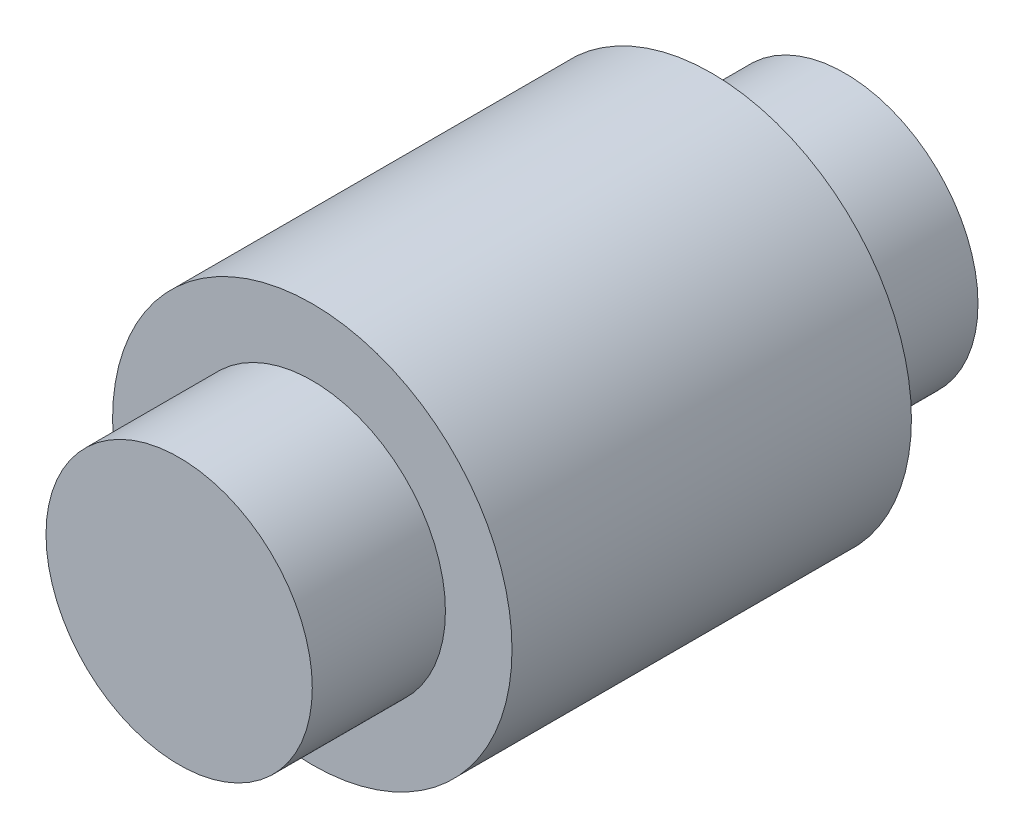
ISO-10303-21;
HEADER;
FILE_DESCRIPTION(('STEP AP214'),'2;1');
FILE_NAME('part.step','',(''),(''),'','','');
FILE_SCHEMA(('AUTOMOTIVE_DESIGN { 1 0 10303 214 1 1 1 1 }'));
ENDSEC;
DATA;
#1=APPLICATION_CONTEXT('core data for automotive mechanical design processes');
#2=APPLICATION_PROTOCOL_DEFINITION('international standard','automotive_design',2000,#1);
#3=PRODUCT_CONTEXT('',#1,'mechanical');
#4=PRODUCT('Part','Part','',(#3));
#5=PRODUCT_RELATED_PRODUCT_CATEGORY('part','',(#4));
#6=PRODUCT_DEFINITION_FORMATION('','',#4);
#7=PRODUCT_DEFINITION_CONTEXT('part definition',#1,'design');
#8=PRODUCT_DEFINITION('design','',#6,#7);
#9=PRODUCT_DEFINITION_SHAPE('','',#8);
#10=(LENGTH_UNIT() NAMED_UNIT(*) SI_UNIT(.MILLI.,.METRE.));
#11=(NAMED_UNIT(*) PLANE_ANGLE_UNIT() SI_UNIT($,.RADIAN.));
#12=(NAMED_UNIT(*) SI_UNIT($,.STERADIAN.) SOLID_ANGLE_UNIT());
#13=UNCERTAINTY_MEASURE_WITH_UNIT(LENGTH_MEASURE(1.E-05),#10,'distance_accuracy_value','');
#14=(GEOMETRIC_REPRESENTATION_CONTEXT(3) GLOBAL_UNCERTAINTY_ASSIGNED_CONTEXT((#13)) GLOBAL_UNIT_ASSIGNED_CONTEXT((#10,
#11,#12)) REPRESENTATION_CONTEXT('',''));
#15=CARTESIAN_POINT('',(0.,0.,0.));
#16=DIRECTION('',(0.,0.,1.));
#17=DIRECTION('',(1.,0.,0.));
#18=AXIS2_PLACEMENT_3D('',#15,#16,#17);
#19=CARTESIAN_POINT('',(0.,0.,5.));
#20=DIRECTION('',(0.,0.,-1.));
#21=DIRECTION('',(-1.,0.,0.));
#22=AXIS2_PLACEMENT_3D('',#19,#20,#21);
#23=CYLINDRICAL_SURFACE('',#22,5.);
#24=CARTESIAN_POINT('',(0.,0.,5.));
#25=DIRECTION('',(0.,0.,1.));
#26=DIRECTION('',(1.,0.,0.));
#27=AXIS2_PLACEMENT_3D('',#24,#25,#26);
#28=CIRCLE('',#27,5.);
#29=CARTESIAN_POINT('',(5.,0.,5.));
#30=VERTEX_POINT('',#29);
#31=EDGE_CURVE('E49',#30,#30,#28,.T.);
#32=ORIENTED_EDGE('',*,*,#31,.F.);
#33=EDGE_LOOP('',(#32));
#34=FACE_BOUND('',#33,.T.);
#35=CARTESIAN_POINT('',(0.,0.,0.));
#36=DIRECTION('',(0.,0.,1.));
#37=DIRECTION('',(1.,0.,0.));
#38=AXIS2_PLACEMENT_3D('',#35,#36,#37);
#39=CIRCLE('',#38,5.);
#40=CARTESIAN_POINT('',(5.,0.,0.));
#41=VERTEX_POINT('',#40);
#42=EDGE_CURVE('E44',#41,#41,#39,.T.);
#43=ORIENTED_EDGE('',*,*,#42,.T.);
#44=EDGE_LOOP('',(#43));
#45=FACE_BOUND('',#44,.T.);
#46=ADVANCED_FACE('F41',(#34,#45),#23,.T.);
#47=CARTESIAN_POINT('',(0.,0.,0.));
#48=DIRECTION('',(0.,0.,1.));
#49=DIRECTION('',(1.,0.,0.));
#50=AXIS2_PLACEMENT_3D('',#47,#48,#49);
#51=PLANE('',#50);
#52=ORIENTED_EDGE('',*,*,#42,.F.);
#53=EDGE_LOOP('',(#52));
#54=FACE_BOUND('',#53,.T.);
#55=ADVANCED_FACE('F87',(#54),#51,.F.);
#56=CARTESIAN_POINT('',(0.,0.,20.));
#57=DIRECTION('',(0.,0.,-1.));
#58=DIRECTION('',(-1.,0.,0.));
#59=AXIS2_PLACEMENT_3D('',#56,#57,#58);
#60=CYLINDRICAL_SURFACE('',#59,7.5);
#61=CARTESIAN_POINT('',(0.,0.,20.));
#62=DIRECTION('',(0.,0.,1.));
#63=DIRECTION('',(1.,0.,0.));
#64=AXIS2_PLACEMENT_3D('',#61,#62,#63);
#65=CIRCLE('',#64,7.5);
#66=CARTESIAN_POINT('',(7.5,0.,20.));
#67=VERTEX_POINT('',#66);
#68=EDGE_CURVE('E61',#67,#67,#65,.T.);
#69=ORIENTED_EDGE('',*,*,#68,.F.);
#70=EDGE_LOOP('',(#69));
#71=FACE_BOUND('',#70,.T.);
#72=CARTESIAN_POINT('',(0.,0.,5.));
#73=DIRECTION('',(0.,0.,1.));
#74=DIRECTION('',(1.,0.,0.));
#75=AXIS2_PLACEMENT_3D('',#72,#73,#74);
#76=CIRCLE('',#75,7.5);
#77=CARTESIAN_POINT('',(7.5,0.,5.));
#78=VERTEX_POINT('',#77);
#79=EDGE_CURVE('E60',#78,#78,#76,.T.);
#80=ORIENTED_EDGE('',*,*,#79,.T.);
#81=EDGE_LOOP('',(#80));
#82=FACE_BOUND('',#81,.T.);
#83=ADVANCED_FACE('F69',(#71,#82),#60,.T.);
#84=CARTESIAN_POINT('',(0.,0.,20.));
#85=DIRECTION('',(0.,0.,1.));
#86=DIRECTION('',(1.,0.,0.));
#87=AXIS2_PLACEMENT_3D('',#84,#85,#86);
#88=PLANE('',#87);
#89=CARTESIAN_POINT('',(0.,0.,20.));
#90=DIRECTION('',(0.,0.,1.));
#91=DIRECTION('',(1.,0.,0.));
#92=AXIS2_PLACEMENT_3D('',#89,#90,#91);
#93=CIRCLE('',#92,5.);
#94=CARTESIAN_POINT('',(5.,0.,20.));
#95=VERTEX_POINT('',#94);
#96=EDGE_CURVE('E10',#95,#95,#93,.T.);
#97=ORIENTED_EDGE('',*,*,#96,.F.);
#98=EDGE_LOOP('',(#97));
#99=FACE_BOUND('',#98,.T.);
#100=ORIENTED_EDGE('',*,*,#68,.T.);
#101=EDGE_LOOP('',(#100));
#102=FACE_BOUND('',#101,.T.);
#103=ADVANCED_FACE('F74',(#99,#102),#88,.T.);
#104=CARTESIAN_POINT('',(0.,0.,5.));
#105=DIRECTION('',(0.,0.,1.));
#106=DIRECTION('',(1.,0.,0.));
#107=AXIS2_PLACEMENT_3D('',#104,#105,#106);
#108=PLANE('',#107);
#109=ORIENTED_EDGE('',*,*,#31,.T.);
#110=EDGE_LOOP('',(#109));
#111=FACE_BOUND('',#110,.T.);
#112=ORIENTED_EDGE('',*,*,#79,.F.);
#113=EDGE_LOOP('',(#112));
#114=FACE_BOUND('',#113,.T.);
#115=ADVANCED_FACE('F71',(#111,#114),#108,.F.);
#116=CARTESIAN_POINT('',(0.,0.,20.));
#117=DIRECTION('',(0.,0.,1.));
#118=DIRECTION('',(1.,0.,0.));
#119=AXIS2_PLACEMENT_3D('',#116,#117,#118);
#120=CYLINDRICAL_SURFACE('',#119,5.);
#121=ORIENTED_EDGE('',*,*,#96,.T.);
#122=EDGE_LOOP('',(#121));
#123=FACE_BOUND('',#122,.T.);
#124=CARTESIAN_POINT('',(0.,0.,25.));
#125=DIRECTION('',(0.,0.,1.));
#126=DIRECTION('',(1.,0.,0.));
#127=AXIS2_PLACEMENT_3D('',#124,#125,#126);
#128=CIRCLE('',#127,5.);
#129=CARTESIAN_POINT('',(5.,0.,25.));
#130=VERTEX_POINT('',#129);
#131=EDGE_CURVE('E56',#130,#130,#128,.T.);
#132=ORIENTED_EDGE('',*,*,#131,.F.);
#133=EDGE_LOOP('',(#132));
#134=FACE_BOUND('',#133,.T.);
#135=ADVANCED_FACE('F73',(#123,#134),#120,.T.);
#136=CARTESIAN_POINT('',(0.,0.,25.));
#137=DIRECTION('',(0.,0.,-1.));
#138=DIRECTION('',(1.,0.,0.));
#139=AXIS2_PLACEMENT_3D('',#136,#137,#138);
#140=PLANE('',#139);
#141=ORIENTED_EDGE('',*,*,#131,.T.);
#142=EDGE_LOOP('',(#141));
#143=FACE_BOUND('',#142,.T.);
#144=ADVANCED_FACE('F81',(#143),#140,.F.);
#145=CLOSED_SHELL('',(#46,#55,#83,#103,#115,#135,#144));
#146=MANIFOLD_SOLID_BREP('B2',#145);
#147=ADVANCED_BREP_SHAPE_REPRESENTATION('',(#18,#146),#14);
#148=SHAPE_DEFINITION_REPRESENTATION(#9,#147);
ENDSEC;
END-ISO-10303-21;
